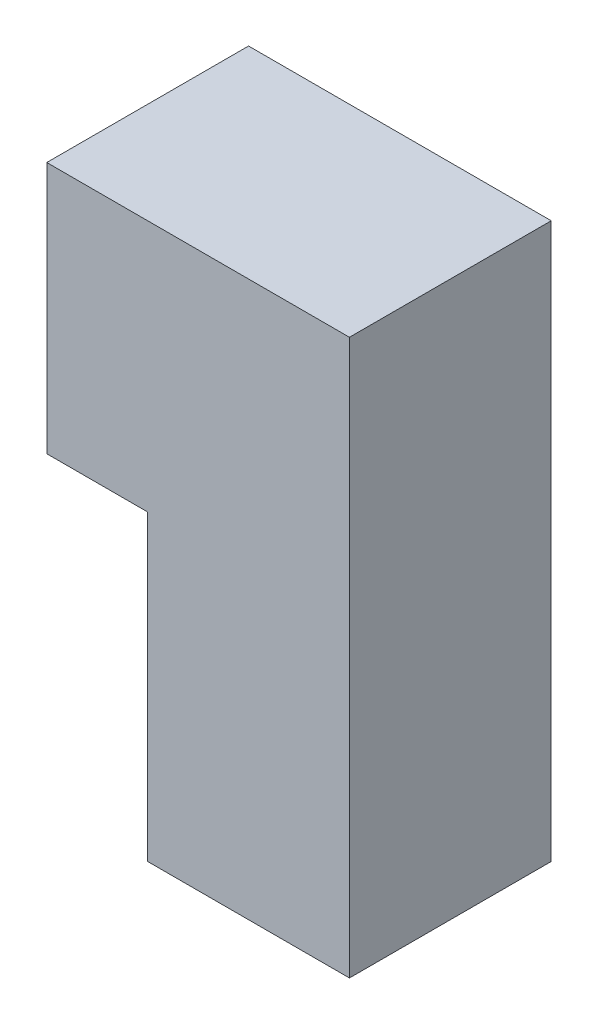
ISO-10303-21;
HEADER;
FILE_DESCRIPTION(('STEP AP214'),'2;1');
FILE_NAME('part.step','',(''),(''),'','','');
FILE_SCHEMA(('AUTOMOTIVE_DESIGN { 1 0 10303 214 1 1 1 1 }'));
ENDSEC;
DATA;
#1=APPLICATION_CONTEXT('core data for automotive mechanical design processes');
#2=APPLICATION_PROTOCOL_DEFINITION('international standard','automotive_design',2000,#1);
#3=PRODUCT_CONTEXT('',#1,'mechanical');
#4=PRODUCT('Part','Part','',(#3));
#5=PRODUCT_RELATED_PRODUCT_CATEGORY('part','',(#4));
#6=PRODUCT_DEFINITION_FORMATION('','',#4);
#7=PRODUCT_DEFINITION_CONTEXT('part definition',#1,'design');
#8=PRODUCT_DEFINITION('design','',#6,#7);
#9=PRODUCT_DEFINITION_SHAPE('','',#8);
#10=(LENGTH_UNIT() NAMED_UNIT(*) SI_UNIT(.MILLI.,.METRE.));
#11=(NAMED_UNIT(*) PLANE_ANGLE_UNIT() SI_UNIT($,.RADIAN.));
#12=(NAMED_UNIT(*) SI_UNIT($,.STERADIAN.) SOLID_ANGLE_UNIT());
#13=UNCERTAINTY_MEASURE_WITH_UNIT(LENGTH_MEASURE(1.E-05),#10,'distance_accuracy_value','');
#14=(GEOMETRIC_REPRESENTATION_CONTEXT(3) GLOBAL_UNCERTAINTY_ASSIGNED_CONTEXT((#13)) GLOBAL_UNIT_ASSIGNED_CONTEXT((#10,
#11,#12)) REPRESENTATION_CONTEXT('',''));
#15=CARTESIAN_POINT('',(0.,0.,0.));
#16=DIRECTION('',(0.,0.,1.));
#17=DIRECTION('',(1.,0.,0.));
#18=AXIS2_PLACEMENT_3D('',#15,#16,#17);
#19=CARTESIAN_POINT('',(60.,0.,40.));
#20=DIRECTION('',(1.,0.,0.));
#21=DIRECTION('',(0.,1.,0.));
#22=AXIS2_PLACEMENT_3D('',#19,#20,#21);
#23=PLANE('',#22);
#24=DIRECTION('',(0.,-1.,0.));
#25=VECTOR('',#24,1.);
#26=CARTESIAN_POINT('',(60.,0.,0.));
#27=LINE('',#26,#25);
#28=CARTESIAN_POINT('',(60.,0.,0.));
#29=VERTEX_POINT('',#28);
#30=CARTESIAN_POINT('',(60.,-110.,0.));
#31=VERTEX_POINT('',#30);
#32=EDGE_CURVE('E134',#29,#31,#27,.T.);
#33=ORIENTED_EDGE('',*,*,#32,.F.);
#34=DIRECTION('',(0.,0.,-1.));
#35=VECTOR('',#34,1.);
#36=CARTESIAN_POINT('',(60.,0.,40.));
#37=LINE('',#36,#35);
#38=CARTESIAN_POINT('',(60.,0.,40.));
#39=VERTEX_POINT('',#38);
#40=EDGE_CURVE('E11',#39,#29,#37,.T.);
#41=ORIENTED_EDGE('',*,*,#40,.F.);
#42=DIRECTION('',(0.,-1.,0.));
#43=VECTOR('',#42,1.);
#44=CARTESIAN_POINT('',(60.,0.,40.));
#45=LINE('',#44,#43);
#46=CARTESIAN_POINT('',(60.,-110.,40.));
#47=VERTEX_POINT('',#46);
#48=EDGE_CURVE('E150',#39,#47,#45,.T.);
#49=ORIENTED_EDGE('',*,*,#48,.T.);
#50=DIRECTION('',(0.,0.,-1.));
#51=VECTOR('',#50,1.);
#52=CARTESIAN_POINT('',(60.,-110.,40.));
#53=LINE('',#52,#51);
#54=EDGE_CURVE('E62',#47,#31,#53,.T.);
#55=ORIENTED_EDGE('',*,*,#54,.T.);
#56=EDGE_LOOP('',(#33,#41,#49,#55));
#57=FACE_BOUND('',#56,.T.);
#58=ADVANCED_FACE('F39',(#57),#23,.T.);
#59=CARTESIAN_POINT('',(0.,0.,40.));
#60=DIRECTION('',(0.,1.,0.));
#61=DIRECTION('',(0.,0.,1.));
#62=AXIS2_PLACEMENT_3D('',#59,#60,#61);
#63=PLANE('',#62);
#64=DIRECTION('',(1.,0.,0.));
#65=VECTOR('',#64,1.);
#66=CARTESIAN_POINT('',(0.,0.,0.));
#67=LINE('',#66,#65);
#68=CARTESIAN_POINT('',(0.,0.,0.));
#69=VERTEX_POINT('',#68);
#70=EDGE_CURVE('E136',#69,#29,#67,.T.);
#71=ORIENTED_EDGE('',*,*,#70,.F.);
#72=DIRECTION('',(0.,0.,-1.));
#73=VECTOR('',#72,1.);
#74=CARTESIAN_POINT('',(0.,0.,40.));
#75=LINE('',#74,#73);
#76=CARTESIAN_POINT('',(0.,0.,40.));
#77=VERTEX_POINT('',#76);
#78=EDGE_CURVE('E46',#77,#69,#75,.T.);
#79=ORIENTED_EDGE('',*,*,#78,.F.);
#80=DIRECTION('',(1.,0.,0.));
#81=VECTOR('',#80,1.);
#82=CARTESIAN_POINT('',(0.,0.,40.));
#83=LINE('',#82,#81);
#84=EDGE_CURVE('E164',#77,#39,#83,.T.);
#85=ORIENTED_EDGE('',*,*,#84,.T.);
#86=ORIENTED_EDGE('',*,*,#40,.T.);
#87=EDGE_LOOP('',(#71,#79,#85,#86));
#88=FACE_BOUND('',#87,.T.);
#89=ADVANCED_FACE('F163',(#88),#63,.T.);
#90=CARTESIAN_POINT('',(0.,0.,40.));
#91=DIRECTION('',(1.,0.,0.));
#92=DIRECTION('',(0.,0.,-1.));
#93=AXIS2_PLACEMENT_3D('',#90,#91,#92);
#94=PLANE('',#93);
#95=DIRECTION('',(0.,-1.,0.));
#96=VECTOR('',#95,1.);
#97=CARTESIAN_POINT('',(0.,0.,0.));
#98=LINE('',#97,#96);
#99=CARTESIAN_POINT('',(0.,-12.5,0.));
#100=VERTEX_POINT('',#99);
#101=EDGE_CURVE('E141',#69,#100,#98,.T.);
#102=ORIENTED_EDGE('',*,*,#101,.T.);
#103=DIRECTION('',(0.,0.,-1.));
#104=VECTOR('',#103,1.);
#105=CARTESIAN_POINT('',(0.,-12.5,30.));
#106=LINE('',#105,#104);
#107=CARTESIAN_POINT('',(0.,-12.5,30.));
#108=VERTEX_POINT('',#107);
#109=EDGE_CURVE('E137',#108,#100,#106,.T.);
#110=ORIENTED_EDGE('',*,*,#109,.F.);
#111=DIRECTION('',(0.,1.,0.));
#112=VECTOR('',#111,1.);
#113=CARTESIAN_POINT('',(0.,0.,30.));
#114=LINE('',#113,#112);
#115=CARTESIAN_POINT('',(0.,-37.5,30.));
#116=VERTEX_POINT('',#115);
#117=EDGE_CURVE('E179',#116,#108,#114,.T.);
#118=ORIENTED_EDGE('',*,*,#117,.F.);
#119=DIRECTION('',(0.,0.,-1.));
#120=VECTOR('',#119,1.);
#121=CARTESIAN_POINT('',(0.,-37.5,30.));
#122=LINE('',#121,#120);
#123=CARTESIAN_POINT('',(0.,-37.5,0.));
#124=VERTEX_POINT('',#123);
#125=EDGE_CURVE('E176',#116,#124,#122,.T.);
#126=ORIENTED_EDGE('',*,*,#125,.T.);
#127=CARTESIAN_POINT('',(0.,-50.,0.));
#128=VERTEX_POINT('',#127);
#129=EDGE_CURVE('E140',#124,#128,#98,.T.);
#130=ORIENTED_EDGE('',*,*,#129,.T.);
#131=DIRECTION('',(0.,0.,-1.));
#132=VECTOR('',#131,1.);
#133=CARTESIAN_POINT('',(0.,-50.,40.));
#134=LINE('',#133,#132);
#135=CARTESIAN_POINT('',(0.,-50.,40.));
#136=VERTEX_POINT('',#135);
#137=EDGE_CURVE('E125',#136,#128,#134,.T.);
#138=ORIENTED_EDGE('',*,*,#137,.F.);
#139=DIRECTION('',(0.,-1.,0.));
#140=VECTOR('',#139,1.);
#141=CARTESIAN_POINT('',(0.,0.,40.));
#142=LINE('',#141,#140);
#143=EDGE_CURVE('E112',#77,#136,#142,.T.);
#144=ORIENTED_EDGE('',*,*,#143,.F.);
#145=ORIENTED_EDGE('',*,*,#78,.T.);
#146=EDGE_LOOP('',(#102,#110,#118,#126,#130,#138,#144,#145));
#147=FACE_BOUND('',#146,.T.);
#148=ADVANCED_FACE('F155',(#147),#94,.F.);
#149=CARTESIAN_POINT('',(0.,-50.,40.));
#150=DIRECTION('',(0.,1.,0.));
#151=DIRECTION('',(-1.,0.,0.));
#152=AXIS2_PLACEMENT_3D('',#149,#150,#151);
#153=PLANE('',#152);
#154=DIRECTION('',(1.,0.,0.));
#155=VECTOR('',#154,1.);
#156=CARTESIAN_POINT('',(0.,-50.,0.));
#157=LINE('',#156,#155);
#158=CARTESIAN_POINT('',(20.,-50.,0.));
#159=VERTEX_POINT('',#158);
#160=EDGE_CURVE('E121',#128,#159,#157,.T.);
#161=ORIENTED_EDGE('',*,*,#160,.T.);
#162=DIRECTION('',(0.,0.,-1.));
#163=VECTOR('',#162,1.);
#164=CARTESIAN_POINT('',(20.,-50.,40.));
#165=LINE('',#164,#163);
#166=CARTESIAN_POINT('',(20.,-50.,40.));
#167=VERTEX_POINT('',#166);
#168=EDGE_CURVE('E118',#167,#159,#165,.T.);
#169=ORIENTED_EDGE('',*,*,#168,.F.);
#170=DIRECTION('',(1.,0.,0.));
#171=VECTOR('',#170,1.);
#172=CARTESIAN_POINT('',(0.,-50.,40.));
#173=LINE('',#172,#171);
#174=EDGE_CURVE('E103',#136,#167,#173,.T.);
#175=ORIENTED_EDGE('',*,*,#174,.F.);
#176=ORIENTED_EDGE('',*,*,#137,.T.);
#177=EDGE_LOOP('',(#161,#169,#175,#176));
#178=FACE_BOUND('',#177,.T.);
#179=ADVANCED_FACE('F119',(#178),#153,.F.);
#180=CARTESIAN_POINT('',(20.,0.,40.));
#181=DIRECTION('',(1.,0.,0.));
#182=DIRECTION('',(0.,1.,0.));
#183=AXIS2_PLACEMENT_3D('',#180,#181,#182);
#184=PLANE('',#183);
#185=DIRECTION('',(0.,-1.,0.));
#186=VECTOR('',#185,1.);
#187=CARTESIAN_POINT('',(20.,0.,0.));
#188=LINE('',#187,#186);
#189=CARTESIAN_POINT('',(20.,-110.,0.));
#190=VERTEX_POINT('',#189);
#191=EDGE_CURVE('E145',#159,#190,#188,.T.);
#192=ORIENTED_EDGE('',*,*,#191,.T.);
#193=DIRECTION('',(0.,0.,-1.));
#194=VECTOR('',#193,1.);
#195=CARTESIAN_POINT('',(20.,-110.,40.));
#196=LINE('',#195,#194);
#197=CARTESIAN_POINT('',(20.,-110.,40.));
#198=VERTEX_POINT('',#197);
#199=EDGE_CURVE('E126',#198,#190,#196,.T.);
#200=ORIENTED_EDGE('',*,*,#199,.F.);
#201=DIRECTION('',(0.,-1.,0.));
#202=VECTOR('',#201,1.);
#203=CARTESIAN_POINT('',(20.,0.,40.));
#204=LINE('',#203,#202);
#205=EDGE_CURVE('E108',#167,#198,#204,.T.);
#206=ORIENTED_EDGE('',*,*,#205,.F.);
#207=ORIENTED_EDGE('',*,*,#168,.T.);
#208=EDGE_LOOP('',(#192,#200,#206,#207));
#209=FACE_BOUND('',#208,.T.);
#210=ADVANCED_FACE('F128',(#209),#184,.F.);
#211=CARTESIAN_POINT('',(0.,-110.,40.));
#212=DIRECTION('',(0.,-1.,0.));
#213=DIRECTION('',(1.,0.,0.));
#214=AXIS2_PLACEMENT_3D('',#211,#212,#213);
#215=PLANE('',#214);
#216=DIRECTION('',(-1.,0.,0.));
#217=VECTOR('',#216,1.);
#218=CARTESIAN_POINT('',(0.,-110.,0.));
#219=LINE('',#218,#217);
#220=EDGE_CURVE('E147',#31,#190,#219,.T.);
#221=ORIENTED_EDGE('',*,*,#220,.F.);
#222=ORIENTED_EDGE('',*,*,#54,.F.);
#223=DIRECTION('',(-1.,0.,0.));
#224=VECTOR('',#223,1.);
#225=CARTESIAN_POINT('',(0.,-110.,40.));
#226=LINE('',#225,#224);
#227=EDGE_CURVE('E129',#47,#198,#226,.T.);
#228=ORIENTED_EDGE('',*,*,#227,.T.);
#229=ORIENTED_EDGE('',*,*,#199,.T.);
#230=EDGE_LOOP('',(#221,#222,#228,#229));
#231=FACE_BOUND('',#230,.T.);
#232=ADVANCED_FACE('F165',(#231),#215,.T.);
#233=CARTESIAN_POINT('',(0.,0.,40.));
#234=DIRECTION('',(0.,0.,1.));
#235=DIRECTION('',(1.,0.,0.));
#236=AXIS2_PLACEMENT_3D('',#233,#234,#235);
#237=PLANE('',#236);
#238=ORIENTED_EDGE('',*,*,#48,.F.);
#239=ORIENTED_EDGE('',*,*,#84,.F.);
#240=ORIENTED_EDGE('',*,*,#143,.T.);
#241=ORIENTED_EDGE('',*,*,#174,.T.);
#242=ORIENTED_EDGE('',*,*,#205,.T.);
#243=ORIENTED_EDGE('',*,*,#227,.F.);
#244=EDGE_LOOP('',(#238,#239,#240,#241,#242,#243));
#245=FACE_BOUND('',#244,.T.);
#246=ADVANCED_FACE('F105',(#245),#237,.T.);
#247=CARTESIAN_POINT('',(0.,0.,0.));
#248=DIRECTION('',(0.,0.,1.));
#249=DIRECTION('',(1.,0.,0.));
#250=AXIS2_PLACEMENT_3D('',#247,#248,#249);
#251=PLANE('',#250);
#252=DIRECTION('',(0.,-1.,0.));
#253=VECTOR('',#252,1.);
#254=CARTESIAN_POINT('',(50.,0.,0.));
#255=LINE('',#254,#253);
#256=CARTESIAN_POINT('',(50.,-12.5,0.));
#257=VERTEX_POINT('',#256);
#258=CARTESIAN_POINT('',(50.,-100.,0.));
#259=VERTEX_POINT('',#258);
#260=EDGE_CURVE('E211',#257,#259,#255,.T.);
#261=ORIENTED_EDGE('',*,*,#260,.F.);
#262=DIRECTION('',(1.,0.,0.));
#263=VECTOR('',#262,1.);
#264=CARTESIAN_POINT('',(0.,-12.5,0.));
#265=LINE('',#264,#263);
#266=EDGE_CURVE('E53',#100,#257,#265,.T.);
#267=ORIENTED_EDGE('',*,*,#266,.F.);
#268=ORIENTED_EDGE('',*,*,#101,.F.);
#269=ORIENTED_EDGE('',*,*,#70,.T.);
#270=ORIENTED_EDGE('',*,*,#32,.T.);
#271=ORIENTED_EDGE('',*,*,#220,.T.);
#272=ORIENTED_EDGE('',*,*,#191,.F.);
#273=ORIENTED_EDGE('',*,*,#160,.F.);
#274=ORIENTED_EDGE('',*,*,#129,.F.);
#275=DIRECTION('',(1.,0.,0.));
#276=VECTOR('',#275,1.);
#277=CARTESIAN_POINT('',(0.,-37.5,0.));
#278=LINE('',#277,#276);
#279=CARTESIAN_POINT('',(30.,-37.5,0.));
#280=VERTEX_POINT('',#279);
#281=EDGE_CURVE('E172',#124,#280,#278,.T.);
#282=ORIENTED_EDGE('',*,*,#281,.T.);
#283=DIRECTION('',(0.,-1.,0.));
#284=VECTOR('',#283,1.);
#285=CARTESIAN_POINT('',(30.,0.,0.));
#286=LINE('',#285,#284);
#287=CARTESIAN_POINT('',(30.,-100.,0.));
#288=VERTEX_POINT('',#287);
#289=EDGE_CURVE('E216',#280,#288,#286,.T.);
#290=ORIENTED_EDGE('',*,*,#289,.T.);
#291=DIRECTION('',(-1.,0.,0.));
#292=VECTOR('',#291,1.);
#293=CARTESIAN_POINT('',(0.,-100.,0.));
#294=LINE('',#293,#292);
#295=EDGE_CURVE('E213',#259,#288,#294,.T.);
#296=ORIENTED_EDGE('',*,*,#295,.F.);
#297=EDGE_LOOP('',(#261,#267,#268,#269,#270,#271,#272,#273,#274,#282,#290,#296));
#298=FACE_BOUND('',#297,.T.);
#299=ADVANCED_FACE('F162',(#298),#251,.F.);
#300=CARTESIAN_POINT('',(0.,-12.5,30.));
#301=DIRECTION('',(0.,1.,0.));
#302=DIRECTION('',(-1.,0.,0.));
#303=AXIS2_PLACEMENT_3D('',#300,#301,#302);
#304=PLANE('',#303);
#305=ORIENTED_EDGE('',*,*,#266,.T.);
#306=DIRECTION('',(0.,0.,-1.));
#307=VECTOR('',#306,1.);
#308=CARTESIAN_POINT('',(50.,-12.5,30.));
#309=LINE('',#308,#307);
#310=CARTESIAN_POINT('',(50.,-12.5,30.));
#311=VERTEX_POINT('',#310);
#312=EDGE_CURVE('E196',#311,#257,#309,.T.);
#313=ORIENTED_EDGE('',*,*,#312,.F.);
#314=DIRECTION('',(1.,0.,0.));
#315=VECTOR('',#314,1.);
#316=CARTESIAN_POINT('',(0.,-12.5,30.));
#317=LINE('',#316,#315);
#318=EDGE_CURVE('E217',#108,#311,#317,.T.);
#319=ORIENTED_EDGE('',*,*,#318,.F.);
#320=ORIENTED_EDGE('',*,*,#109,.T.);
#321=EDGE_LOOP('',(#305,#313,#319,#320));
#322=FACE_BOUND('',#321,.T.);
#323=ADVANCED_FACE('F257',(#322),#304,.F.);
#324=CARTESIAN_POINT('',(0.,-37.5,30.));
#325=DIRECTION('',(0.,1.,0.));
#326=DIRECTION('',(-1.,0.,0.));
#327=AXIS2_PLACEMENT_3D('',#324,#325,#326);
#328=PLANE('',#327);
#329=ORIENTED_EDGE('',*,*,#281,.F.);
#330=ORIENTED_EDGE('',*,*,#125,.F.);
#331=DIRECTION('',(1.,0.,0.));
#332=VECTOR('',#331,1.);
#333=CARTESIAN_POINT('',(0.,-37.5,30.));
#334=LINE('',#333,#332);
#335=CARTESIAN_POINT('',(30.,-37.5,30.));
#336=VERTEX_POINT('',#335);
#337=EDGE_CURVE('E202',#116,#336,#334,.T.);
#338=ORIENTED_EDGE('',*,*,#337,.T.);
#339=DIRECTION('',(0.,0.,-1.));
#340=VECTOR('',#339,1.);
#341=CARTESIAN_POINT('',(30.,-37.5,30.));
#342=LINE('',#341,#340);
#343=EDGE_CURVE('E183',#336,#280,#342,.T.);
#344=ORIENTED_EDGE('',*,*,#343,.T.);
#345=EDGE_LOOP('',(#329,#330,#338,#344));
#346=FACE_BOUND('',#345,.T.);
#347=ADVANCED_FACE('F255',(#346),#328,.T.);
#348=CARTESIAN_POINT('',(30.,0.,30.));
#349=DIRECTION('',(1.,0.,0.));
#350=DIRECTION('',(0.,1.,0.));
#351=AXIS2_PLACEMENT_3D('',#348,#349,#350);
#352=PLANE('',#351);
#353=ORIENTED_EDGE('',*,*,#289,.F.);
#354=ORIENTED_EDGE('',*,*,#343,.F.);
#355=DIRECTION('',(0.,-1.,0.));
#356=VECTOR('',#355,1.);
#357=CARTESIAN_POINT('',(30.,0.,30.));
#358=LINE('',#357,#356);
#359=CARTESIAN_POINT('',(30.,-100.,30.));
#360=VERTEX_POINT('',#359);
#361=EDGE_CURVE('E206',#336,#360,#358,.T.);
#362=ORIENTED_EDGE('',*,*,#361,.T.);
#363=DIRECTION('',(0.,0.,-1.));
#364=VECTOR('',#363,1.);
#365=CARTESIAN_POINT('',(30.,-100.,30.));
#366=LINE('',#365,#364);
#367=EDGE_CURVE('E187',#360,#288,#366,.T.);
#368=ORIENTED_EDGE('',*,*,#367,.T.);
#369=EDGE_LOOP('',(#353,#354,#362,#368));
#370=FACE_BOUND('',#369,.T.);
#371=ADVANCED_FACE('F234',(#370),#352,.T.);
#372=CARTESIAN_POINT('',(0.,-100.,30.));
#373=DIRECTION('',(0.,-1.,0.));
#374=DIRECTION('',(0.,0.,-1.));
#375=AXIS2_PLACEMENT_3D('',#372,#373,#374);
#376=PLANE('',#375);
#377=ORIENTED_EDGE('',*,*,#295,.T.);
#378=ORIENTED_EDGE('',*,*,#367,.F.);
#379=DIRECTION('',(-1.,0.,0.));
#380=VECTOR('',#379,1.);
#381=CARTESIAN_POINT('',(0.,-100.,30.));
#382=LINE('',#381,#380);
#383=CARTESIAN_POINT('',(50.,-100.,30.));
#384=VERTEX_POINT('',#383);
#385=EDGE_CURVE('E223',#384,#360,#382,.T.);
#386=ORIENTED_EDGE('',*,*,#385,.F.);
#387=DIRECTION('',(0.,0.,-1.));
#388=VECTOR('',#387,1.);
#389=CARTESIAN_POINT('',(50.,-100.,30.));
#390=LINE('',#389,#388);
#391=EDGE_CURVE('E193',#384,#259,#390,.T.);
#392=ORIENTED_EDGE('',*,*,#391,.T.);
#393=EDGE_LOOP('',(#377,#378,#386,#392));
#394=FACE_BOUND('',#393,.T.);
#395=ADVANCED_FACE('F241',(#394),#376,.F.);
#396=CARTESIAN_POINT('',(50.,0.,30.));
#397=DIRECTION('',(1.,0.,0.));
#398=DIRECTION('',(0.,0.,-1.));
#399=AXIS2_PLACEMENT_3D('',#396,#397,#398);
#400=PLANE('',#399);
#401=ORIENTED_EDGE('',*,*,#260,.T.);
#402=ORIENTED_EDGE('',*,*,#391,.F.);
#403=DIRECTION('',(0.,-1.,0.));
#404=VECTOR('',#403,1.);
#405=CARTESIAN_POINT('',(50.,0.,30.));
#406=LINE('',#405,#404);
#407=EDGE_CURVE('E218',#311,#384,#406,.T.);
#408=ORIENTED_EDGE('',*,*,#407,.F.);
#409=ORIENTED_EDGE('',*,*,#312,.T.);
#410=EDGE_LOOP('',(#401,#402,#408,#409));
#411=FACE_BOUND('',#410,.T.);
#412=ADVANCED_FACE('F246',(#411),#400,.F.);
#413=CARTESIAN_POINT('',(0.,0.,30.));
#414=DIRECTION('',(0.,0.,-1.));
#415=DIRECTION('',(-1.,0.,0.));
#416=AXIS2_PLACEMENT_3D('',#413,#414,#415);
#417=PLANE('',#416);
#418=ORIENTED_EDGE('',*,*,#318,.T.);
#419=ORIENTED_EDGE('',*,*,#407,.T.);
#420=ORIENTED_EDGE('',*,*,#385,.T.);
#421=ORIENTED_EDGE('',*,*,#361,.F.);
#422=ORIENTED_EDGE('',*,*,#337,.F.);
#423=ORIENTED_EDGE('',*,*,#117,.T.);
#424=EDGE_LOOP('',(#418,#419,#420,#421,#422,#423));
#425=FACE_BOUND('',#424,.T.);
#426=ADVANCED_FACE('F243',(#425),#417,.T.);
#427=CLOSED_SHELL('',(#58,#89,#148,#179,#210,#232,#246,#299,#323,#347,#371,#395,#412,#426));
#428=MANIFOLD_SOLID_BREP('B2',#427);
#429=ADVANCED_BREP_SHAPE_REPRESENTATION('',(#18,#428),#14);
#430=SHAPE_DEFINITION_REPRESENTATION(#9,#429);
ENDSEC;
END-ISO-10303-21;
